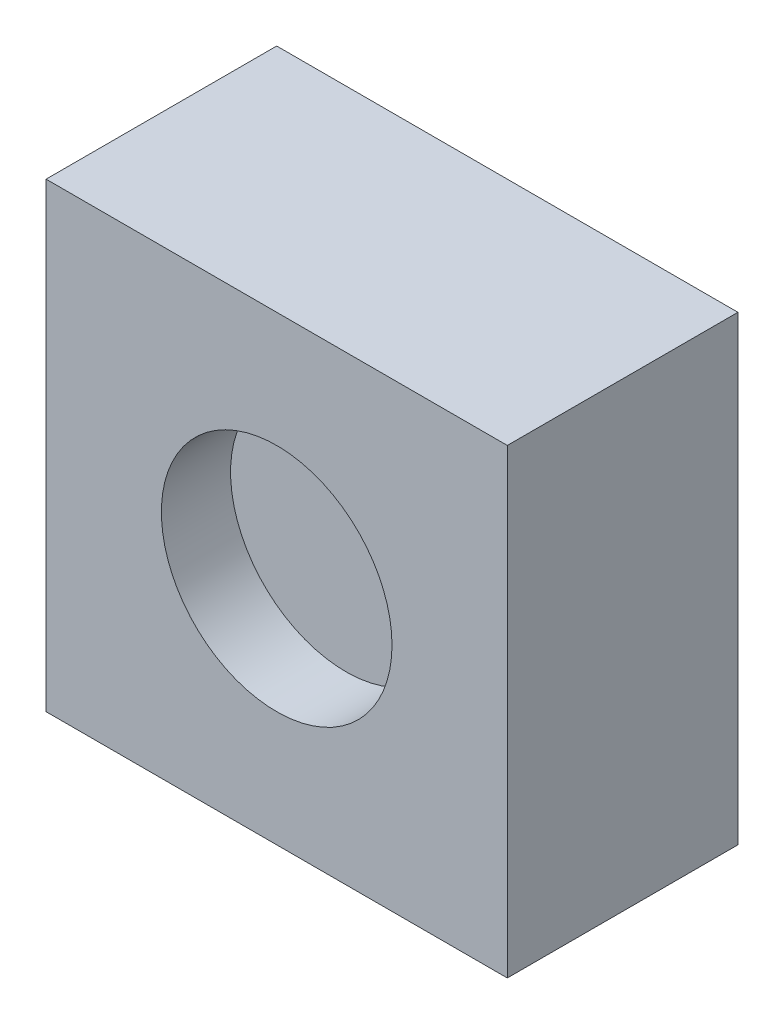
ISO-10303-21;
HEADER;
FILE_DESCRIPTION(('STEP AP214'),'2;1');
FILE_NAME('part.step','',(''),(''),'','','');
FILE_SCHEMA(('AUTOMOTIVE_DESIGN { 1 0 10303 214 1 1 1 1 }'));
ENDSEC;
DATA;
#1=APPLICATION_CONTEXT('core data for automotive mechanical design processes');
#2=APPLICATION_PROTOCOL_DEFINITION('international standard','automotive_design',2000,#1);
#3=PRODUCT_CONTEXT('',#1,'mechanical');
#4=PRODUCT('Part','Part','',(#3));
#5=PRODUCT_RELATED_PRODUCT_CATEGORY('part','',(#4));
#6=PRODUCT_DEFINITION_FORMATION('','',#4);
#7=PRODUCT_DEFINITION_CONTEXT('part definition',#1,'design');
#8=PRODUCT_DEFINITION('design','',#6,#7);
#9=PRODUCT_DEFINITION_SHAPE('','',#8);
#10=(LENGTH_UNIT() NAMED_UNIT(*) SI_UNIT(.MILLI.,.METRE.));
#11=(NAMED_UNIT(*) PLANE_ANGLE_UNIT() SI_UNIT($,.RADIAN.));
#12=(NAMED_UNIT(*) SI_UNIT($,.STERADIAN.) SOLID_ANGLE_UNIT());
#13=UNCERTAINTY_MEASURE_WITH_UNIT(LENGTH_MEASURE(1.E-05),#10,'distance_accuracy_value','');
#14=(GEOMETRIC_REPRESENTATION_CONTEXT(3) GLOBAL_UNCERTAINTY_ASSIGNED_CONTEXT((#13)) GLOBAL_UNIT_ASSIGNED_CONTEXT((#10,
#11,#12)) REPRESENTATION_CONTEXT('',''));
#15=CARTESIAN_POINT('',(0.,0.,0.));
#16=DIRECTION('',(0.,0.,1.));
#17=DIRECTION('',(1.,0.,0.));
#18=AXIS2_PLACEMENT_3D('',#15,#16,#17);
#19=CARTESIAN_POINT('',(0.,0.,10.));
#20=DIRECTION('',(1.,0.,0.));
#21=DIRECTION('',(0.,0.,-1.));
#22=AXIS2_PLACEMENT_3D('',#19,#20,#21);
#23=PLANE('',#22);
#24=DIRECTION('',(0.,-1.,0.));
#25=VECTOR('',#24,1.);
#26=CARTESIAN_POINT('',(0.,0.,0.));
#27=LINE('',#26,#25);
#28=CARTESIAN_POINT('',(0.,20.,0.));
#29=VERTEX_POINT('',#28);
#30=CARTESIAN_POINT('',(0.,0.,0.));
#31=VERTEX_POINT('',#30);
#32=EDGE_CURVE('E100',#29,#31,#27,.T.);
#33=ORIENTED_EDGE('',*,*,#32,.T.);
#34=DIRECTION('',(0.,0.,-1.));
#35=VECTOR('',#34,1.);
#36=CARTESIAN_POINT('',(0.,0.,10.));
#37=LINE('',#36,#35);
#38=CARTESIAN_POINT('',(0.,0.,10.));
#39=VERTEX_POINT('',#38);
#40=EDGE_CURVE('E11',#39,#31,#37,.T.);
#41=ORIENTED_EDGE('',*,*,#40,.F.);
#42=DIRECTION('',(0.,-1.,0.));
#43=VECTOR('',#42,1.);
#44=CARTESIAN_POINT('',(0.,0.,10.));
#45=LINE('',#44,#43);
#46=CARTESIAN_POINT('',(0.,20.,10.));
#47=VERTEX_POINT('',#46);
#48=EDGE_CURVE('E88',#47,#39,#45,.T.);
#49=ORIENTED_EDGE('',*,*,#48,.F.);
#50=DIRECTION('',(0.,0.,-1.));
#51=VECTOR('',#50,1.);
#52=CARTESIAN_POINT('',(0.,20.,10.));
#53=LINE('',#52,#51);
#54=EDGE_CURVE('E96',#47,#29,#53,.T.);
#55=ORIENTED_EDGE('',*,*,#54,.T.);
#56=EDGE_LOOP('',(#33,#41,#49,#55));
#57=FACE_BOUND('',#56,.T.);
#58=ADVANCED_FACE('F37',(#57),#23,.F.);
#59=CARTESIAN_POINT('',(0.,0.,10.));
#60=DIRECTION('',(0.,1.,0.));
#61=DIRECTION('',(0.,0.,1.));
#62=AXIS2_PLACEMENT_3D('',#59,#60,#61);
#63=PLANE('',#62);
#64=DIRECTION('',(1.,0.,0.));
#65=VECTOR('',#64,1.);
#66=CARTESIAN_POINT('',(0.,0.,0.));
#67=LINE('',#66,#65);
#68=CARTESIAN_POINT('',(20.,0.,0.));
#69=VERTEX_POINT('',#68);
#70=EDGE_CURVE('E92',#31,#69,#67,.T.);
#71=ORIENTED_EDGE('',*,*,#70,.T.);
#72=DIRECTION('',(0.,0.,-1.));
#73=VECTOR('',#72,1.);
#74=CARTESIAN_POINT('',(20.,0.,10.));
#75=LINE('',#74,#73);
#76=CARTESIAN_POINT('',(20.,0.,10.));
#77=VERTEX_POINT('',#76);
#78=EDGE_CURVE('E45',#77,#69,#75,.T.);
#79=ORIENTED_EDGE('',*,*,#78,.F.);
#80=DIRECTION('',(1.,0.,0.));
#81=VECTOR('',#80,1.);
#82=CARTESIAN_POINT('',(0.,0.,10.));
#83=LINE('',#82,#81);
#84=EDGE_CURVE('E83',#39,#77,#83,.T.);
#85=ORIENTED_EDGE('',*,*,#84,.F.);
#86=ORIENTED_EDGE('',*,*,#40,.T.);
#87=EDGE_LOOP('',(#71,#79,#85,#86));
#88=FACE_BOUND('',#87,.T.);
#89=ADVANCED_FACE('F91',(#88),#63,.F.);
#90=CARTESIAN_POINT('',(20.,0.,10.));
#91=DIRECTION('',(-1.,0.,0.));
#92=DIRECTION('',(0.,0.,1.));
#93=AXIS2_PLACEMENT_3D('',#90,#91,#92);
#94=PLANE('',#93);
#95=DIRECTION('',(0.,1.,0.));
#96=VECTOR('',#95,1.);
#97=CARTESIAN_POINT('',(20.,0.,0.));
#98=LINE('',#97,#96);
#99=CARTESIAN_POINT('',(20.,20.,0.));
#100=VERTEX_POINT('',#99);
#101=EDGE_CURVE('E70',#69,#100,#98,.T.);
#102=ORIENTED_EDGE('',*,*,#101,.T.);
#103=DIRECTION('',(0.,0.,-1.));
#104=VECTOR('',#103,1.);
#105=CARTESIAN_POINT('',(20.,20.,10.));
#106=LINE('',#105,#104);
#107=CARTESIAN_POINT('',(20.,20.,10.));
#108=VERTEX_POINT('',#107);
#109=EDGE_CURVE('E93',#108,#100,#106,.T.);
#110=ORIENTED_EDGE('',*,*,#109,.F.);
#111=DIRECTION('',(0.,1.,0.));
#112=VECTOR('',#111,1.);
#113=CARTESIAN_POINT('',(20.,0.,10.));
#114=LINE('',#113,#112);
#115=EDGE_CURVE('E86',#77,#108,#114,.T.);
#116=ORIENTED_EDGE('',*,*,#115,.F.);
#117=ORIENTED_EDGE('',*,*,#78,.T.);
#118=EDGE_LOOP('',(#102,#110,#116,#117));
#119=FACE_BOUND('',#118,.T.);
#120=ADVANCED_FACE('F94',(#119),#94,.F.);
#121=CARTESIAN_POINT('',(0.,20.,10.));
#122=DIRECTION('',(0.,-1.,0.));
#123=DIRECTION('',(0.,0.,-1.));
#124=AXIS2_PLACEMENT_3D('',#121,#122,#123);
#125=PLANE('',#124);
#126=DIRECTION('',(-1.,0.,0.));
#127=VECTOR('',#126,1.);
#128=CARTESIAN_POINT('',(0.,20.,0.));
#129=LINE('',#128,#127);
#130=EDGE_CURVE('E76',#100,#29,#129,.T.);
#131=ORIENTED_EDGE('',*,*,#130,.T.);
#132=ORIENTED_EDGE('',*,*,#54,.F.);
#133=DIRECTION('',(-1.,0.,0.));
#134=VECTOR('',#133,1.);
#135=CARTESIAN_POINT('',(0.,20.,10.));
#136=LINE('',#135,#134);
#137=EDGE_CURVE('E53',#108,#47,#136,.T.);
#138=ORIENTED_EDGE('',*,*,#137,.F.);
#139=ORIENTED_EDGE('',*,*,#109,.T.);
#140=EDGE_LOOP('',(#131,#132,#138,#139));
#141=FACE_BOUND('',#140,.T.);
#142=ADVANCED_FACE('F108',(#141),#125,.F.);
#143=CARTESIAN_POINT('',(0.,0.,10.));
#144=DIRECTION('',(0.,0.,-1.));
#145=DIRECTION('',(-1.,0.,0.));
#146=AXIS2_PLACEMENT_3D('',#143,#144,#145);
#147=PLANE('',#146);
#148=CARTESIAN_POINT('',(10.,10.,10.));
#149=DIRECTION('',(0.,0.,1.));
#150=DIRECTION('',(1.,0.,0.));
#151=AXIS2_PLACEMENT_3D('',#148,#149,#150);
#152=CIRCLE('',#151,5.);
#153=CARTESIAN_POINT('',(15.,10.,10.));
#154=VERTEX_POINT('',#153);
#155=EDGE_CURVE('E114',#154,#154,#152,.T.);
#156=ORIENTED_EDGE('',*,*,#155,.F.);
#157=EDGE_LOOP('',(#156));
#158=FACE_BOUND('',#157,.T.);
#159=ORIENTED_EDGE('',*,*,#48,.T.);
#160=ORIENTED_EDGE('',*,*,#84,.T.);
#161=ORIENTED_EDGE('',*,*,#115,.T.);
#162=ORIENTED_EDGE('',*,*,#137,.T.);
#163=EDGE_LOOP('',(#159,#160,#161,#162));
#164=FACE_BOUND('',#163,.T.);
#165=ADVANCED_FACE('F84',(#158,#164),#147,.F.);
#166=CARTESIAN_POINT('',(0.,0.,0.));
#167=DIRECTION('',(0.,0.,-1.));
#168=DIRECTION('',(-1.,0.,0.));
#169=AXIS2_PLACEMENT_3D('',#166,#167,#168);
#170=PLANE('',#169);
#171=CARTESIAN_POINT('',(6.1,13.9,0.));
#172=DIRECTION('',(0.,0.,-1.));
#173=DIRECTION('',(-1.,0.,0.));
#174=AXIS2_PLACEMENT_3D('',#171,#172,#173);
#175=CIRCLE('',#174,2.);
#176=CARTESIAN_POINT('',(4.1,13.9,0.));
#177=VERTEX_POINT('',#176);
#178=EDGE_CURVE('E133',#177,#177,#175,.T.);
#179=ORIENTED_EDGE('',*,*,#178,.F.);
#180=EDGE_LOOP('',(#179));
#181=FACE_BOUND('',#180,.T.);
#182=CARTESIAN_POINT('',(13.9,6.1,0.));
#183=DIRECTION('',(0.,0.,-1.));
#184=DIRECTION('',(-1.,0.,0.));
#185=AXIS2_PLACEMENT_3D('',#182,#183,#184);
#186=CIRCLE('',#185,2.);
#187=CARTESIAN_POINT('',(11.9,6.1,0.));
#188=VERTEX_POINT('',#187);
#189=EDGE_CURVE('E126',#188,#188,#186,.T.);
#190=ORIENTED_EDGE('',*,*,#189,.F.);
#191=EDGE_LOOP('',(#190));
#192=FACE_BOUND('',#191,.T.);
#193=CARTESIAN_POINT('',(6.1,6.1,0.));
#194=DIRECTION('',(0.,0.,-1.));
#195=DIRECTION('',(-1.,0.,0.));
#196=AXIS2_PLACEMENT_3D('',#193,#194,#195);
#197=CIRCLE('',#196,2.);
#198=CARTESIAN_POINT('',(4.1,6.1,0.));
#199=VERTEX_POINT('',#198);
#200=EDGE_CURVE('E138',#199,#199,#197,.T.);
#201=ORIENTED_EDGE('',*,*,#200,.F.);
#202=EDGE_LOOP('',(#201));
#203=FACE_BOUND('',#202,.T.);
#204=CARTESIAN_POINT('',(13.9,13.9,0.));
#205=DIRECTION('',(0.,0.,-1.));
#206=DIRECTION('',(-1.,0.,0.));
#207=AXIS2_PLACEMENT_3D('',#204,#205,#206);
#208=CIRCLE('',#207,2.);
#209=CARTESIAN_POINT('',(11.9,13.9,0.));
#210=VERTEX_POINT('',#209);
#211=EDGE_CURVE('E120',#210,#210,#208,.T.);
#212=ORIENTED_EDGE('',*,*,#211,.F.);
#213=EDGE_LOOP('',(#212));
#214=FACE_BOUND('',#213,.T.);
#215=ORIENTED_EDGE('',*,*,#32,.F.);
#216=ORIENTED_EDGE('',*,*,#130,.F.);
#217=ORIENTED_EDGE('',*,*,#101,.F.);
#218=ORIENTED_EDGE('',*,*,#70,.F.);
#219=EDGE_LOOP('',(#215,#216,#217,#218));
#220=FACE_BOUND('',#219,.T.);
#221=ADVANCED_FACE('F111',(#181,#192,#203,#214,#220),#170,.T.);
#222=CARTESIAN_POINT('',(10.,10.,7.));
#223=DIRECTION('',(0.,0.,1.));
#224=DIRECTION('',(1.,0.,0.));
#225=AXIS2_PLACEMENT_3D('',#222,#223,#224);
#226=CYLINDRICAL_SURFACE('',#225,5.);
#227=CARTESIAN_POINT('',(10.,10.,7.));
#228=DIRECTION('',(0.,0.,1.));
#229=DIRECTION('',(1.,0.,0.));
#230=AXIS2_PLACEMENT_3D('',#227,#228,#229);
#231=CIRCLE('',#230,5.);
#232=CARTESIAN_POINT('',(15.,10.,7.));
#233=VERTEX_POINT('',#232);
#234=EDGE_CURVE('E103',#233,#233,#231,.T.);
#235=ORIENTED_EDGE('',*,*,#234,.F.);
#236=EDGE_LOOP('',(#235));
#237=FACE_BOUND('',#236,.T.);
#238=ORIENTED_EDGE('',*,*,#155,.T.);
#239=EDGE_LOOP('',(#238));
#240=FACE_BOUND('',#239,.T.);
#241=ADVANCED_FACE('F155',(#237,#240),#226,.F.);
#242=CARTESIAN_POINT('',(10.,10.,7.));
#243=DIRECTION('',(0.,0.,1.));
#244=DIRECTION('',(1.,0.,0.));
#245=AXIS2_PLACEMENT_3D('',#242,#243,#244);
#246=PLANE('',#245);
#247=ORIENTED_EDGE('',*,*,#234,.T.);
#248=EDGE_LOOP('',(#247));
#249=FACE_BOUND('',#248,.T.);
#250=ADVANCED_FACE('F162',(#249),#246,.T.);
#251=CARTESIAN_POINT('',(13.9,13.9,3.));
#252=DIRECTION('',(0.,0.,-1.));
#253=DIRECTION('',(-1.,0.,0.));
#254=AXIS2_PLACEMENT_3D('',#251,#252,#253);
#255=CYLINDRICAL_SURFACE('',#254,2.);
#256=CARTESIAN_POINT('',(13.9,13.9,3.));
#257=DIRECTION('',(0.,0.,-1.));
#258=DIRECTION('',(-1.,0.,0.));
#259=AXIS2_PLACEMENT_3D('',#256,#257,#258);
#260=CIRCLE('',#259,2.);
#261=CARTESIAN_POINT('',(11.9,13.9,3.));
#262=VERTEX_POINT('',#261);
#263=EDGE_CURVE('E117',#262,#262,#260,.T.);
#264=ORIENTED_EDGE('',*,*,#263,.F.);
#265=EDGE_LOOP('',(#264));
#266=FACE_BOUND('',#265,.T.);
#267=ORIENTED_EDGE('',*,*,#211,.T.);
#268=EDGE_LOOP('',(#267));
#269=FACE_BOUND('',#268,.T.);
#270=ADVANCED_FACE('F160',(#266,#269),#255,.F.);
#271=CARTESIAN_POINT('',(13.9,13.9,3.));
#272=DIRECTION('',(0.,0.,-1.));
#273=DIRECTION('',(-1.,0.,0.));
#274=AXIS2_PLACEMENT_3D('',#271,#272,#273);
#275=PLANE('',#274);
#276=ORIENTED_EDGE('',*,*,#263,.T.);
#277=EDGE_LOOP('',(#276));
#278=FACE_BOUND('',#277,.T.);
#279=ADVANCED_FACE('F149',(#278),#275,.T.);
#280=CARTESIAN_POINT('',(6.1,6.1,3.));
#281=DIRECTION('',(0.,0.,-1.));
#282=DIRECTION('',(-1.,0.,0.));
#283=AXIS2_PLACEMENT_3D('',#280,#281,#282);
#284=CYLINDRICAL_SURFACE('',#283,2.);
#285=CARTESIAN_POINT('',(6.1,6.1,3.));
#286=DIRECTION('',(0.,0.,-1.));
#287=DIRECTION('',(-1.,0.,0.));
#288=AXIS2_PLACEMENT_3D('',#285,#286,#287);
#289=CIRCLE('',#288,2.);
#290=CARTESIAN_POINT('',(4.1,6.1,3.));
#291=VERTEX_POINT('',#290);
#292=EDGE_CURVE('E130',#291,#291,#289,.T.);
#293=ORIENTED_EDGE('',*,*,#292,.F.);
#294=EDGE_LOOP('',(#293));
#295=FACE_BOUND('',#294,.T.);
#296=ORIENTED_EDGE('',*,*,#200,.T.);
#297=EDGE_LOOP('',(#296));
#298=FACE_BOUND('',#297,.T.);
#299=ADVANCED_FACE('F146',(#295,#298),#284,.F.);
#300=CARTESIAN_POINT('',(6.1,6.1,3.));
#301=DIRECTION('',(0.,0.,-1.));
#302=DIRECTION('',(-1.,0.,0.));
#303=AXIS2_PLACEMENT_3D('',#300,#301,#302);
#304=PLANE('',#303);
#305=ORIENTED_EDGE('',*,*,#292,.T.);
#306=EDGE_LOOP('',(#305));
#307=FACE_BOUND('',#306,.T.);
#308=ADVANCED_FACE('F144',(#307),#304,.T.);
#309=CARTESIAN_POINT('',(13.9,6.1,3.));
#310=DIRECTION('',(0.,0.,-1.));
#311=DIRECTION('',(-1.,0.,0.));
#312=AXIS2_PLACEMENT_3D('',#309,#310,#311);
#313=CYLINDRICAL_SURFACE('',#312,2.);
#314=CARTESIAN_POINT('',(13.9,6.1,3.));
#315=DIRECTION('',(0.,0.,-1.));
#316=DIRECTION('',(-1.,0.,0.));
#317=AXIS2_PLACEMENT_3D('',#314,#315,#316);
#318=CIRCLE('',#317,2.);
#319=CARTESIAN_POINT('',(11.9,6.1,3.));
#320=VERTEX_POINT('',#319);
#321=EDGE_CURVE('E129',#320,#320,#318,.T.);
#322=ORIENTED_EDGE('',*,*,#321,.F.);
#323=EDGE_LOOP('',(#322));
#324=FACE_BOUND('',#323,.T.);
#325=ORIENTED_EDGE('',*,*,#189,.T.);
#326=EDGE_LOOP('',(#325));
#327=FACE_BOUND('',#326,.T.);
#328=ADVANCED_FACE('F236',(#324,#327),#313,.F.);
#329=CARTESIAN_POINT('',(13.9,6.1,3.));
#330=DIRECTION('',(0.,0.,-1.));
#331=DIRECTION('',(-1.,0.,0.));
#332=AXIS2_PLACEMENT_3D('',#329,#330,#331);
#333=PLANE('',#332);
#334=ORIENTED_EDGE('',*,*,#321,.T.);
#335=EDGE_LOOP('',(#334));
#336=FACE_BOUND('',#335,.T.);
#337=ADVANCED_FACE('F243',(#336),#333,.T.);
#338=CARTESIAN_POINT('',(6.1,13.9,3.));
#339=DIRECTION('',(0.,0.,-1.));
#340=DIRECTION('',(-1.,0.,0.));
#341=AXIS2_PLACEMENT_3D('',#338,#339,#340);
#342=CYLINDRICAL_SURFACE('',#341,2.);
#343=CARTESIAN_POINT('',(6.1,13.9,3.));
#344=DIRECTION('',(0.,0.,-1.));
#345=DIRECTION('',(-1.,0.,0.));
#346=AXIS2_PLACEMENT_3D('',#343,#344,#345);
#347=CIRCLE('',#346,2.);
#348=CARTESIAN_POINT('',(4.1,13.9,3.));
#349=VERTEX_POINT('',#348);
#350=EDGE_CURVE('E123',#349,#349,#347,.T.);
#351=ORIENTED_EDGE('',*,*,#350,.F.);
#352=EDGE_LOOP('',(#351));
#353=FACE_BOUND('',#352,.T.);
#354=ORIENTED_EDGE('',*,*,#178,.T.);
#355=EDGE_LOOP('',(#354));
#356=FACE_BOUND('',#355,.T.);
#357=ADVANCED_FACE('F251',(#353,#356),#342,.F.);
#358=CARTESIAN_POINT('',(6.1,13.9,3.));
#359=DIRECTION('',(0.,0.,-1.));
#360=DIRECTION('',(-1.,0.,0.));
#361=AXIS2_PLACEMENT_3D('',#358,#359,#360);
#362=PLANE('',#361);
#363=ORIENTED_EDGE('',*,*,#350,.T.);
#364=EDGE_LOOP('',(#363));
#365=FACE_BOUND('',#364,.T.);
#366=ADVANCED_FACE('F259',(#365),#362,.T.);
#367=CLOSED_SHELL('',(#58,#89,#120,#142,#165,#221,#241,#250,#270,#279,#299,#308,#328,#337,#357,#366));
#368=MANIFOLD_SOLID_BREP('B2',#367);
#369=ADVANCED_BREP_SHAPE_REPRESENTATION('',(#18,#368),#14);
#370=SHAPE_DEFINITION_REPRESENTATION(#9,#369);
ENDSEC;
END-ISO-10303-21;
